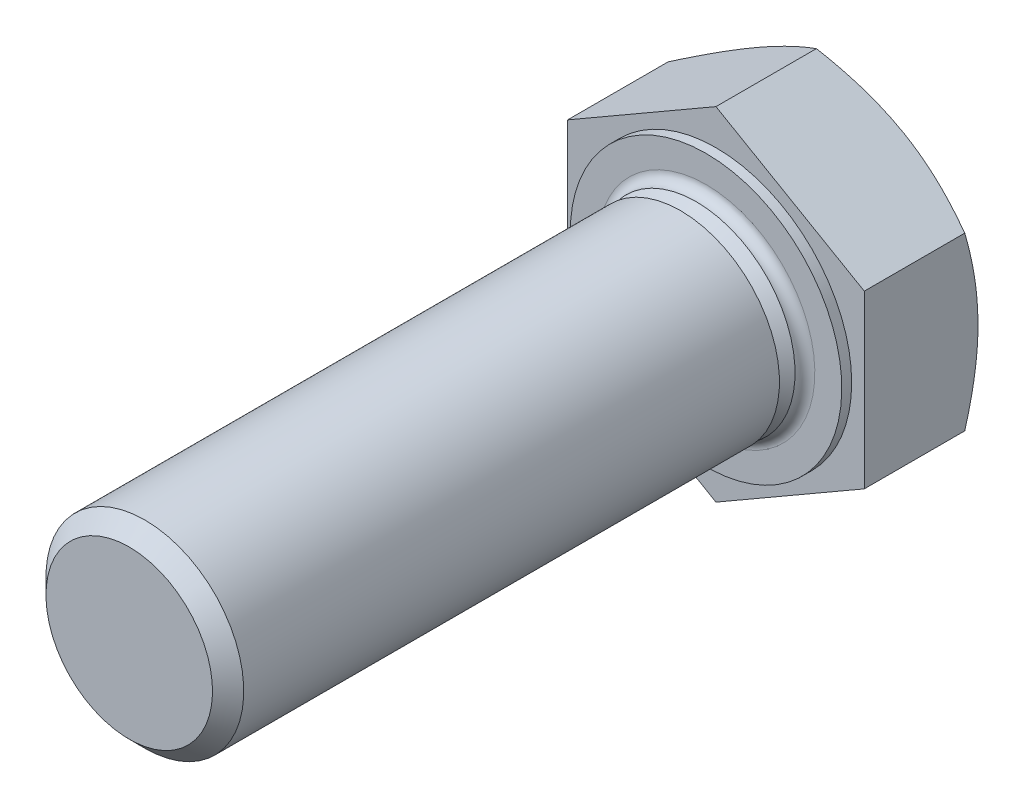
ISO-10303-21;
HEADER;
FILE_DESCRIPTION(('STEP AP214'),'2;1');
FILE_NAME('part.step','',(''),(''),'','','');
FILE_SCHEMA(('AUTOMOTIVE_DESIGN { 1 0 10303 214 1 1 1 1 }'));
ENDSEC;
DATA;
#1=APPLICATION_CONTEXT('core data for automotive mechanical design processes');
#2=APPLICATION_PROTOCOL_DEFINITION('international standard','automotive_design',2000,#1);
#3=PRODUCT_CONTEXT('',#1,'mechanical');
#4=PRODUCT('Part','Part','',(#3));
#5=PRODUCT_RELATED_PRODUCT_CATEGORY('part','',(#4));
#6=PRODUCT_DEFINITION_FORMATION('','',#4);
#7=PRODUCT_DEFINITION_CONTEXT('part definition',#1,'design');
#8=PRODUCT_DEFINITION('design','',#6,#7);
#9=PRODUCT_DEFINITION_SHAPE('','',#8);
#10=(LENGTH_UNIT() NAMED_UNIT(*) SI_UNIT(.MILLI.,.METRE.));
#11=(NAMED_UNIT(*) PLANE_ANGLE_UNIT() SI_UNIT($,.RADIAN.));
#12=(NAMED_UNIT(*) SI_UNIT($,.STERADIAN.) SOLID_ANGLE_UNIT());
#13=UNCERTAINTY_MEASURE_WITH_UNIT(LENGTH_MEASURE(1.E-05),#10,'distance_accuracy_value','');
#14=(GEOMETRIC_REPRESENTATION_CONTEXT(3) GLOBAL_UNCERTAINTY_ASSIGNED_CONTEXT((#13)) GLOBAL_UNIT_ASSIGNED_CONTEXT((#10,
#11,#12)) REPRESENTATION_CONTEXT('',''));
#15=CARTESIAN_POINT('',(0.,0.,0.));
#16=DIRECTION('',(0.,0.,1.));
#17=DIRECTION('',(1.,0.,0.));
#18=AXIS2_PLACEMENT_3D('',#15,#16,#17);
#19=CARTESIAN_POINT('',(0.,2.52640625,35.));
#20=DIRECTION('',(0.,0.,1.));
#21=DIRECTION('',(0.,1.,0.));
#22=AXIS2_PLACEMENT_3D('',#19,#20,#21);
#23=PLANE('',#22);
#24=CARTESIAN_POINT('',(0.,0.,35.));
#25=DIRECTION('',(0.,0.,1.));
#26=DIRECTION('',(0.,1.,0.));
#27=AXIS2_PLACEMENT_3D('',#24,#25,#26);
#28=CIRCLE('',#27,5.0528125);
#29=CARTESIAN_POINT('',(0.,5.0528125,35.));
#30=VERTEX_POINT('',#29);
#31=EDGE_CURVE('E11',#30,#30,#28,.T.);
#32=ORIENTED_EDGE('',*,*,#31,.T.);
#33=EDGE_LOOP('',(#32));
#34=FACE_BOUND('',#33,.T.);
#35=ADVANCED_FACE('F17',(#34),#23,.T.);
#36=CARTESIAN_POINT('',(0.,0.,34.52640625));
#37=DIRECTION('',(0.,0.,-1.));
#38=DIRECTION('',(0.,1.,0.));
#39=AXIS2_PLACEMENT_3D('',#36,#37,#38);
#40=CONICAL_SURFACE('',#39,5.52640625,0.785398163397449);
#41=CARTESIAN_POINT('',(0.,0.,34.0528125));
#42=DIRECTION('',(0.,0.,1.));
#43=DIRECTION('',(0.,1.,0.));
#44=AXIS2_PLACEMENT_3D('',#41,#42,#43);
#45=CIRCLE('',#44,6.);
#46=CARTESIAN_POINT('',(0.,6.,34.0528125));
#47=VERTEX_POINT('',#46);
#48=EDGE_CURVE('E27',#47,#47,#45,.T.);
#49=ORIENTED_EDGE('',*,*,#48,.T.);
#50=EDGE_LOOP('',(#49));
#51=FACE_BOUND('',#50,.T.);
#52=ORIENTED_EDGE('',*,*,#31,.F.);
#53=EDGE_LOOP('',(#52));
#54=FACE_BOUND('',#53,.T.);
#55=ADVANCED_FACE('F321',(#51,#54),#40,.T.);
#56=CARTESIAN_POINT('',(0.,0.,17.8));
#57=DIRECTION('',(0.,0.,-1.));
#58=DIRECTION('',(0.,1.,0.));
#59=AXIS2_PLACEMENT_3D('',#56,#57,#58);
#60=CYLINDRICAL_SURFACE('',#59,6.);
#61=CARTESIAN_POINT('',(0.,0.,1.5471875));
#62=DIRECTION('',(0.,0.,1.));
#63=DIRECTION('',(0.,1.,0.));
#64=AXIS2_PLACEMENT_3D('',#61,#62,#63);
#65=CIRCLE('',#64,6.);
#66=CARTESIAN_POINT('',(0.,6.,1.5471875));
#67=VERTEX_POINT('',#66);
#68=EDGE_CURVE('E257',#67,#67,#65,.T.);
#69=ORIENTED_EDGE('',*,*,#68,.T.);
#70=EDGE_LOOP('',(#69));
#71=FACE_BOUND('',#70,.T.);
#72=ORIENTED_EDGE('',*,*,#48,.F.);
#73=EDGE_LOOP('',(#72));
#74=FACE_BOUND('',#73,.T.);
#75=ADVANCED_FACE('F326',(#71,#74),#60,.T.);
#76=CARTESIAN_POINT('',(0.,5.52640625,1.5471875));
#77=DIRECTION('',(0.,0.,-1.));
#78=DIRECTION('',(0.,-1.,0.));
#79=AXIS2_PLACEMENT_3D('',#76,#77,#78);
#80=PLANE('',#79);
#81=CARTESIAN_POINT('',(0.,0.,1.5471875));
#82=DIRECTION('',(0.,0.,1.));
#83=DIRECTION('',(0.,1.,0.));
#84=AXIS2_PLACEMENT_3D('',#81,#82,#83);
#85=CIRCLE('',#84,5.0528125);
#86=CARTESIAN_POINT('',(0.,5.0528125,1.5471875));
#87=VERTEX_POINT('',#86);
#88=EDGE_CURVE('E278',#87,#87,#85,.T.);
#89=ORIENTED_EDGE('',*,*,#88,.T.);
#90=EDGE_LOOP('',(#89));
#91=FACE_BOUND('',#90,.T.);
#92=ORIENTED_EDGE('',*,*,#68,.F.);
#93=EDGE_LOOP('',(#92));
#94=FACE_BOUND('',#93,.T.);
#95=ADVANCED_FACE('F350',(#91,#94),#80,.T.);
#96=CARTESIAN_POINT('',(0.,0.,1.07359375));
#97=DIRECTION('',(0.,0.,-1.));
#98=DIRECTION('',(0.,1.,0.));
#99=AXIS2_PLACEMENT_3D('',#96,#97,#98);
#100=CONICAL_SURFACE('',#99,5.52640625,0.785398163397448);
#101=CARTESIAN_POINT('',(0.,0.,0.6));
#102=DIRECTION('',(0.,0.,1.));
#103=DIRECTION('',(0.,1.,0.));
#104=AXIS2_PLACEMENT_3D('',#101,#102,#103);
#105=CIRCLE('',#104,6.);
#106=CARTESIAN_POINT('',(0.,6.,0.6));
#107=VERTEX_POINT('',#106);
#108=EDGE_CURVE('E21',#107,#107,#105,.T.);
#109=ORIENTED_EDGE('',*,*,#108,.T.);
#110=EDGE_LOOP('',(#109));
#111=FACE_BOUND('',#110,.T.);
#112=ORIENTED_EDGE('',*,*,#88,.F.);
#113=EDGE_LOOP('',(#112));
#114=FACE_BOUND('',#113,.T.);
#115=ADVANCED_FACE('F353',(#111,#114),#100,.T.);
#116=CARTESIAN_POINT('',(0.,0.,0.6));
#117=DIRECTION('',(0.,0.,1.));
#118=DIRECTION('',(1.,0.,0.));
#119=AXIS2_PLACEMENT_3D('',#116,#117,#118);
#120=TOROIDAL_SURFACE('',#119,6.6,0.6);
#121=CARTESIAN_POINT('',(0.,0.,0.));
#122=DIRECTION('',(0.,0.,1.));
#123=DIRECTION('',(0.,1.,0.));
#124=AXIS2_PLACEMENT_3D('',#121,#122,#123);
#125=CIRCLE('',#124,6.6);
#126=CARTESIAN_POINT('',(0.,6.6,0.));
#127=VERTEX_POINT('',#126);
#128=EDGE_CURVE('E185',#127,#127,#125,.T.);
#129=ORIENTED_EDGE('',*,*,#128,.T.);
#130=EDGE_LOOP('',(#129));
#131=FACE_BOUND('',#130,.T.);
#132=ORIENTED_EDGE('',*,*,#108,.F.);
#133=EDGE_LOOP('',(#132));
#134=FACE_BOUND('',#133,.T.);
#135=ADVANCED_FACE('F346',(#131,#134),#120,.F.);
#136=CARTESIAN_POINT('',(0.,7.4175,0.));
#137=DIRECTION('',(0.,0.,1.));
#138=DIRECTION('',(0.,1.,0.));
#139=AXIS2_PLACEMENT_3D('',#136,#137,#138);
#140=PLANE('',#139);
#141=CARTESIAN_POINT('',(0.,0.,0.));
#142=DIRECTION('',(0.,0.,1.));
#143=DIRECTION('',(0.,1.,0.));
#144=AXIS2_PLACEMENT_3D('',#141,#142,#143);
#145=CIRCLE('',#144,8.235);
#146=CARTESIAN_POINT('',(0.,8.235,0.));
#147=VERTEX_POINT('',#146);
#148=EDGE_CURVE('E190',#147,#147,#145,.T.);
#149=ORIENTED_EDGE('',*,*,#148,.T.);
#150=EDGE_LOOP('',(#149));
#151=FACE_BOUND('',#150,.T.);
#152=ORIENTED_EDGE('',*,*,#128,.F.);
#153=EDGE_LOOP('',(#152));
#154=FACE_BOUND('',#153,.T.);
#155=ADVANCED_FACE('F347',(#151,#154),#140,.T.);
#156=CARTESIAN_POINT('',(0.,0.,-0.55));
#157=DIRECTION('',(0.,0.,-1.));
#158=DIRECTION('',(0.,1.,0.));
#159=AXIS2_PLACEMENT_3D('',#156,#157,#158);
#160=CYLINDRICAL_SURFACE('',#159,8.235);
#161=ORIENTED_EDGE('',*,*,#148,.F.);
#162=EDGE_LOOP('',(#161));
#163=FACE_BOUND('',#162,.T.);
#164=CARTESIAN_POINT('',(0.,0.,-0.6));
#165=DIRECTION('',(0.,0.,1.));
#166=DIRECTION('',(0.,1.,0.));
#167=AXIS2_PLACEMENT_3D('',#164,#165,#166);
#168=CIRCLE('',#167,8.235);
#169=CARTESIAN_POINT('',(0.,-8.235,-0.6));
#170=VERTEX_POINT('',#169);
#171=EDGE_CURVE('E156',#170,#170,#168,.T.);
#172=ORIENTED_EDGE('',*,*,#171,.T.);
#173=EDGE_LOOP('',(#172));
#174=FACE_BOUND('',#173,.T.);
#175=ADVANCED_FACE('F330',(#163,#174),#160,.T.);
#176=CARTESIAN_POINT('',(-4.5,-7.79422863405995,0.4));
#177=DIRECTION('',(-0.5,-0.866025403784439,0.));
#178=DIRECTION('',(-0.866025403784439,0.5,0.));
#179=AXIS2_PLACEMENT_3D('',#176,#177,#178);
#180=PLANE('',#179);
#181=CARTESIAN_POINT('',(0.00466633059542045,-10.3949989526387,-6.69459637448047));
#182=CARTESIAN_POINT('',(-2.4096675960114,-9.00108261019856,-7.49999999999999));
#183=CARTESIAN_POINT('',(-4.5,-7.79422863405995,-7.5));
#184=CARTESIAN_POINT('',(-6.59033240398861,-6.58737465792134,-7.50000000000001));
#185=CARTESIAN_POINT('',(-9.00466633059542,-5.19345831548124,-6.69459637448047));
#186=(BOUNDED_CURVE() B_SPLINE_CURVE(2,(#181,#182,#183,#184,#185),.UNSPECIFIED.,.F.,
.F.) B_SPLINE_CURVE_WITH_KNOTS((3,2,3),(0.,5.27698475776278,10.5539695155256),
.UNSPECIFIED.) CURVE() GEOMETRIC_REPRESENTATION_ITEM() RATIONAL_B_SPLINE_CURVE((1.,
1.03802697460135,1.,1.03802697460134,1.)) REPRESENTATION_ITEM(''));
#187=CARTESIAN_POINT('',(0.,-10.3923048454133,-6.69615242270663));
#188=VERTEX_POINT('',#187);
#189=CARTESIAN_POINT('',(-4.5,-7.79422863405995,-7.5));
#190=VERTEX_POINT('',#189);
#191=EDGE_CURVE('E233',#188,#190,#186,.T.);
#192=ORIENTED_EDGE('',*,*,#191,.F.);
#193=DIRECTION('',(0.,0.,-1.));
#194=VECTOR('',#193,1.);
#195=CARTESIAN_POINT('',(0.,-10.3923048454133,0.4));
#196=LINE('',#195,#194);
#197=CARTESIAN_POINT('',(0.,-10.3923048454133,-0.6));
#198=VERTEX_POINT('',#197);
#199=EDGE_CURVE('E151',#198,#188,#196,.T.);
#200=ORIENTED_EDGE('',*,*,#199,.F.);
#201=DIRECTION('',(0.866025403784439,-0.5,0.));
#202=VECTOR('',#201,1.);
#203=CARTESIAN_POINT('',(-3.3747082409576,-8.44391613405995,-0.6));
#204=LINE('',#203,#202);
#205=CARTESIAN_POINT('',(-9.,-5.19615242270663,-0.6));
#206=VERTEX_POINT('',#205);
#207=EDGE_CURVE('E192',#206,#198,#204,.T.);
#208=ORIENTED_EDGE('',*,*,#207,.F.);
#209=DIRECTION('',(0.,0.,-1.));
#210=VECTOR('',#209,1.);
#211=CARTESIAN_POINT('',(-9.,-5.19615242270663,0.4));
#212=LINE('',#211,#210);
#213=CARTESIAN_POINT('',(-9.,-5.19615242270663,-6.69615242270663));
#214=VERTEX_POINT('',#213);
#215=EDGE_CURVE('E148',#206,#214,#212,.T.);
#216=ORIENTED_EDGE('',*,*,#215,.T.);
#217=CARTESIAN_POINT('',(0.00466633059542045,-10.3949989526387,-6.69459637448047));
#218=CARTESIAN_POINT('',(-2.4096675960114,-9.00108261019856,-7.49999999999999));
#219=CARTESIAN_POINT('',(-4.5,-7.79422863405995,-7.5));
#220=CARTESIAN_POINT('',(-6.59033240398861,-6.58737465792134,-7.50000000000001));
#221=CARTESIAN_POINT('',(-9.00466633059542,-5.19345831548124,-6.69459637448047));
#222=(BOUNDED_CURVE() B_SPLINE_CURVE(2,(#217,#218,#219,#220,#221),.UNSPECIFIED.,.F.,
.F.) B_SPLINE_CURVE_WITH_KNOTS((3,2,3),(0.,5.27698475776278,10.5539695155256),
.UNSPECIFIED.) CURVE() GEOMETRIC_REPRESENTATION_ITEM() RATIONAL_B_SPLINE_CURVE((1.,
1.03802697460135,1.,1.03802697460134,1.)) REPRESENTATION_ITEM(''));
#223=EDGE_CURVE('E232',#190,#214,#222,.T.);
#224=ORIENTED_EDGE('',*,*,#223,.F.);
#225=EDGE_LOOP('',(#192,#200,#208,#216,#224));
#226=FACE_BOUND('',#225,.T.);
#227=ADVANCED_FACE('F297',(#226),#180,.T.);
#228=CARTESIAN_POINT('',(9.,0.,0.4));
#229=DIRECTION('',(1.,0.,0.));
#230=DIRECTION('',(0.,-1.,0.));
#231=AXIS2_PLACEMENT_3D('',#228,#229,#230);
#232=PLANE('',#231);
#233=CARTESIAN_POINT('',(9.,5.20154063715742,-6.69459637448047));
#234=CARTESIAN_POINT('',(8.99999999999999,2.41370795227724,-7.5));
#235=CARTESIAN_POINT('',(9.,0.,-7.5));
#236=CARTESIAN_POINT('',(9.00000000000001,-2.41370795227723,-7.5));
#237=CARTESIAN_POINT('',(9.,-5.20154063715742,-6.69459637448047));
#238=(BOUNDED_CURVE() B_SPLINE_CURVE(2,(#233,#234,#235,#236,#237),.UNSPECIFIED.,.F.,
.F.) B_SPLINE_CURVE_WITH_KNOTS((3,2,3),(0.,5.27698475776278,10.5539695155256),
.UNSPECIFIED.) CURVE() GEOMETRIC_REPRESENTATION_ITEM() RATIONAL_B_SPLINE_CURVE((1.,
1.03802697460134,1.,1.03802697460134,1.)) REPRESENTATION_ITEM(''));
#239=CARTESIAN_POINT('',(9.,5.19615242270664,-6.69615242270663));
#240=VERTEX_POINT('',#239);
#241=CARTESIAN_POINT('',(9.,0.,-7.5));
#242=VERTEX_POINT('',#241);
#243=EDGE_CURVE('E127',#240,#242,#238,.T.);
#244=ORIENTED_EDGE('',*,*,#243,.F.);
#245=DIRECTION('',(0.,0.,-1.));
#246=VECTOR('',#245,1.);
#247=CARTESIAN_POINT('',(9.,5.19615242270664,0.4));
#248=LINE('',#247,#246);
#249=CARTESIAN_POINT('',(9.,5.19615242270664,-0.6));
#250=VERTEX_POINT('',#249);
#251=EDGE_CURVE('E117',#250,#240,#248,.T.);
#252=ORIENTED_EDGE('',*,*,#251,.F.);
#253=DIRECTION('',(0.,1.,0.));
#254=VECTOR('',#253,1.);
#255=CARTESIAN_POINT('',(9.,-2.59875,-0.6));
#256=LINE('',#255,#254);
#257=CARTESIAN_POINT('',(9.,-5.19615242270663,-0.6));
#258=VERTEX_POINT('',#257);
#259=EDGE_CURVE('E184',#258,#250,#256,.T.);
#260=ORIENTED_EDGE('',*,*,#259,.F.);
#261=DIRECTION('',(0.,0.,-1.));
#262=VECTOR('',#261,1.);
#263=CARTESIAN_POINT('',(9.,-5.19615242270663,0.4));
#264=LINE('',#263,#262);
#265=CARTESIAN_POINT('',(9.,-5.19615242270663,-6.69615242270663));
#266=VERTEX_POINT('',#265);
#267=EDGE_CURVE('E149',#258,#266,#264,.T.);
#268=ORIENTED_EDGE('',*,*,#267,.T.);
#269=CARTESIAN_POINT('',(9.,5.20154063715742,-6.69459637448047));
#270=CARTESIAN_POINT('',(8.99999999999999,2.41370795227724,-7.5));
#271=CARTESIAN_POINT('',(9.,0.,-7.5));
#272=CARTESIAN_POINT('',(9.00000000000001,-2.41370795227723,-7.5));
#273=CARTESIAN_POINT('',(9.,-5.20154063715742,-6.69459637448047));
#274=(BOUNDED_CURVE() B_SPLINE_CURVE(2,(#269,#270,#271,#272,#273),.UNSPECIFIED.,.F.,
.F.) B_SPLINE_CURVE_WITH_KNOTS((3,2,3),(0.,5.27698475776278,10.5539695155256),
.UNSPECIFIED.) CURVE() GEOMETRIC_REPRESENTATION_ITEM() RATIONAL_B_SPLINE_CURVE((1.,
1.03802697460134,1.,1.03802697460134,1.)) REPRESENTATION_ITEM(''));
#275=EDGE_CURVE('E157',#242,#266,#274,.T.);
#276=ORIENTED_EDGE('',*,*,#275,.F.);
#277=EDGE_LOOP('',(#244,#252,#260,#268,#276));
#278=FACE_BOUND('',#277,.T.);
#279=ADVANCED_FACE('F307',(#278),#232,.T.);
#280=CARTESIAN_POINT('',(4.5,-7.79422863405995,0.4));
#281=DIRECTION('',(0.5,-0.866025403784439,0.));
#282=DIRECTION('',(-0.866025403784439,-0.5,0.));
#283=AXIS2_PLACEMENT_3D('',#280,#281,#282);
#284=PLANE('',#283);
#285=CARTESIAN_POINT('',(9.00466633059542,-5.19345831548124,-6.69459637448047));
#286=CARTESIAN_POINT('',(6.5903324039886,-6.58737465792133,-7.5));
#287=CARTESIAN_POINT('',(4.5,-7.79422863405995,-7.5));
#288=CARTESIAN_POINT('',(2.40966759601141,-9.00108261019856,-7.5));
#289=CARTESIAN_POINT('',(-0.00466633059541883,-10.3949989526387,-6.69459637448047));
#290=(BOUNDED_CURVE() B_SPLINE_CURVE(2,(#285,#286,#287,#288,#289),.UNSPECIFIED.,.F.,
.F.) B_SPLINE_CURVE_WITH_KNOTS((3,2,3),(0.,5.27698475776278,10.5539695155256),
.UNSPECIFIED.) CURVE() GEOMETRIC_REPRESENTATION_ITEM() RATIONAL_B_SPLINE_CURVE((1.,
1.03802697460133,1.,1.03802697460134,1.)) REPRESENTATION_ITEM(''));
#291=CARTESIAN_POINT('',(4.5,-7.79422863405995,-7.5));
#292=VERTEX_POINT('',#291);
#293=EDGE_CURVE('E164',#266,#292,#290,.T.);
#294=ORIENTED_EDGE('',*,*,#293,.F.);
#295=ORIENTED_EDGE('',*,*,#267,.F.);
#296=DIRECTION('',(0.866025403784439,0.5,0.));
#297=VECTOR('',#296,1.);
#298=CARTESIAN_POINT('',(3.3747082409576,-8.44391613405995,-0.6));
#299=LINE('',#298,#297);
#300=EDGE_CURVE('E203',#198,#258,#299,.T.);
#301=ORIENTED_EDGE('',*,*,#300,.F.);
#302=ORIENTED_EDGE('',*,*,#199,.T.);
#303=CARTESIAN_POINT('',(9.00466633059542,-5.19345831548124,-6.69459637448047));
#304=CARTESIAN_POINT('',(6.5903324039886,-6.58737465792133,-7.5));
#305=CARTESIAN_POINT('',(4.5,-7.79422863405995,-7.5));
#306=CARTESIAN_POINT('',(2.40966759601141,-9.00108261019856,-7.5));
#307=CARTESIAN_POINT('',(-0.00466633059541883,-10.3949989526387,-6.69459637448047));
#308=(BOUNDED_CURVE() B_SPLINE_CURVE(2,(#303,#304,#305,#306,#307),.UNSPECIFIED.,.F.,
.F.) B_SPLINE_CURVE_WITH_KNOTS((3,2,3),(0.,5.27698475776278,10.5539695155256),
.UNSPECIFIED.) CURVE() GEOMETRIC_REPRESENTATION_ITEM() RATIONAL_B_SPLINE_CURVE((1.,
1.03802697460133,1.,1.03802697460134,1.)) REPRESENTATION_ITEM(''));
#309=EDGE_CURVE('E242',#292,#188,#308,.T.);
#310=ORIENTED_EDGE('',*,*,#309,.F.);
#311=EDGE_LOOP('',(#294,#295,#301,#302,#310));
#312=FACE_BOUND('',#311,.T.);
#313=ADVANCED_FACE('F208',(#312),#284,.T.);
#314=CARTESIAN_POINT('',(-9.,0.,0.4));
#315=DIRECTION('',(-1.,0.,0.));
#316=DIRECTION('',(0.,1.,0.));
#317=AXIS2_PLACEMENT_3D('',#314,#315,#316);
#318=PLANE('',#317);
#319=CARTESIAN_POINT('',(-9.,-5.20154063715742,-6.69459637448047));
#320=CARTESIAN_POINT('',(-9.,-2.41370795227722,-7.5));
#321=CARTESIAN_POINT('',(-9.,0.,-7.5));
#322=CARTESIAN_POINT('',(-9.,2.41370795227723,-7.5));
#323=CARTESIAN_POINT('',(-9.,5.20154063715742,-6.69459637448047));
#324=(BOUNDED_CURVE() B_SPLINE_CURVE(2,(#319,#320,#321,#322,#323),.UNSPECIFIED.,.F.,
.F.) B_SPLINE_CURVE_WITH_KNOTS((3,2,3),(0.,5.27698475776278,10.5539695155256),
.UNSPECIFIED.) CURVE() GEOMETRIC_REPRESENTATION_ITEM() RATIONAL_B_SPLINE_CURVE((1.,
1.03802697460134,1.,1.03802697460134,1.)) REPRESENTATION_ITEM(''));
#325=CARTESIAN_POINT('',(-9.,0.,-7.5));
#326=VERTEX_POINT('',#325);
#327=CARTESIAN_POINT('',(-9.,5.19615242270663,-6.69615242270663));
#328=VERTEX_POINT('',#327);
#329=EDGE_CURVE('E133',#326,#328,#324,.T.);
#330=ORIENTED_EDGE('',*,*,#329,.F.);
#331=CARTESIAN_POINT('',(-9.,-5.20154063715742,-6.69459637448047));
#332=CARTESIAN_POINT('',(-9.,-2.41370795227722,-7.5));
#333=CARTESIAN_POINT('',(-9.,0.,-7.5));
#334=CARTESIAN_POINT('',(-9.,2.41370795227723,-7.5));
#335=CARTESIAN_POINT('',(-9.,5.20154063715742,-6.69459637448047));
#336=(BOUNDED_CURVE() B_SPLINE_CURVE(2,(#331,#332,#333,#334,#335),.UNSPECIFIED.,.F.,
.F.) B_SPLINE_CURVE_WITH_KNOTS((3,2,3),(0.,5.27698475776278,10.5539695155256),
.UNSPECIFIED.) CURVE() GEOMETRIC_REPRESENTATION_ITEM() RATIONAL_B_SPLINE_CURVE((1.,
1.03802697460134,1.,1.03802697460134,1.)) REPRESENTATION_ITEM(''));
#337=EDGE_CURVE('E223',#214,#326,#336,.T.);
#338=ORIENTED_EDGE('',*,*,#337,.F.);
#339=ORIENTED_EDGE('',*,*,#215,.F.);
#340=DIRECTION('',(0.,-1.,0.));
#341=VECTOR('',#340,1.);
#342=CARTESIAN_POINT('',(-9.,-2.59875,-0.6));
#343=LINE('',#342,#341);
#344=CARTESIAN_POINT('',(-9.,5.19615242270663,-0.6));
#345=VERTEX_POINT('',#344);
#346=EDGE_CURVE('E194',#345,#206,#343,.T.);
#347=ORIENTED_EDGE('',*,*,#346,.F.);
#348=DIRECTION('',(0.,0.,-1.));
#349=VECTOR('',#348,1.);
#350=CARTESIAN_POINT('',(-9.,5.19615242270663,0.4));
#351=LINE('',#350,#349);
#352=EDGE_CURVE('E118',#345,#328,#351,.T.);
#353=ORIENTED_EDGE('',*,*,#352,.T.);
#354=EDGE_LOOP('',(#330,#338,#339,#347,#353));
#355=FACE_BOUND('',#354,.T.);
#356=ADVANCED_FACE('F305',(#355),#318,.T.);
#357=CARTESIAN_POINT('',(4.5,7.79422863405995,0.4));
#358=DIRECTION('',(0.5,0.866025403784439,0.));
#359=DIRECTION('',(0.866025403784439,-0.5,0.));
#360=AXIS2_PLACEMENT_3D('',#357,#358,#359);
#361=PLANE('',#360);
#362=CARTESIAN_POINT('',(-0.00466633059542454,10.3949989526387,-6.69459637448047));
#363=CARTESIAN_POINT('',(2.40966759601141,9.00108261019857,-7.50000000000001));
#364=CARTESIAN_POINT('',(4.5,7.79422863405995,-7.5));
#365=CARTESIAN_POINT('',(6.59033240398859,6.58737465792134,-7.5));
#366=CARTESIAN_POINT('',(9.00466633059542,5.19345831548124,-6.69459637448047));
#367=(BOUNDED_CURVE() B_SPLINE_CURVE(2,(#362,#363,#364,#365,#366),.UNSPECIFIED.,.F.,
.F.) B_SPLINE_CURVE_WITH_KNOTS((3,2,3),(0.,5.27698475776278,10.5539695155256),
.UNSPECIFIED.) CURVE() GEOMETRIC_REPRESENTATION_ITEM() RATIONAL_B_SPLINE_CURVE((1.,
1.03802697460134,1.,1.03802697460133,1.)) REPRESENTATION_ITEM(''));
#368=CARTESIAN_POINT('',(4.5,7.79422863405995,-7.5));
#369=VERTEX_POINT('',#368);
#370=EDGE_CURVE('E131',#369,#240,#367,.T.);
#371=ORIENTED_EDGE('',*,*,#370,.F.);
#372=CARTESIAN_POINT('',(-0.00466633059542454,10.3949989526387,-6.69459637448047));
#373=CARTESIAN_POINT('',(2.40966759601141,9.00108261019857,-7.50000000000001));
#374=CARTESIAN_POINT('',(4.5,7.79422863405995,-7.5));
#375=CARTESIAN_POINT('',(6.59033240398859,6.58737465792134,-7.5));
#376=CARTESIAN_POINT('',(9.00466633059542,5.19345831548124,-6.69459637448047));
#377=(BOUNDED_CURVE() B_SPLINE_CURVE(2,(#372,#373,#374,#375,#376),.UNSPECIFIED.,.F.,
.F.) B_SPLINE_CURVE_WITH_KNOTS((3,2,3),(0.,5.27698475776278,10.5539695155256),
.UNSPECIFIED.) CURVE() GEOMETRIC_REPRESENTATION_ITEM() RATIONAL_B_SPLINE_CURVE((1.,
1.03802697460134,1.,1.03802697460133,1.)) REPRESENTATION_ITEM(''));
#378=CARTESIAN_POINT('',(0.,10.3923048454133,-6.69615242270663));
#379=VERTEX_POINT('',#378);
#380=EDGE_CURVE('E123',#379,#369,#377,.T.);
#381=ORIENTED_EDGE('',*,*,#380,.F.);
#382=DIRECTION('',(0.,0.,-1.));
#383=VECTOR('',#382,1.);
#384=CARTESIAN_POINT('',(0.,10.3923048454133,0.4));
#385=LINE('',#384,#383);
#386=CARTESIAN_POINT('',(0.,10.3923048454133,-0.6));
#387=VERTEX_POINT('',#386);
#388=EDGE_CURVE('E105',#387,#379,#385,.T.);
#389=ORIENTED_EDGE('',*,*,#388,.F.);
#390=DIRECTION('',(-0.866025403784439,0.5,0.));
#391=VECTOR('',#390,1.);
#392=CARTESIAN_POINT('',(5.6252917590424,7.14454113405995,-0.6));
#393=LINE('',#392,#391);
#394=EDGE_CURVE('E213',#250,#387,#393,.T.);
#395=ORIENTED_EDGE('',*,*,#394,.F.);
#396=ORIENTED_EDGE('',*,*,#251,.T.);
#397=EDGE_LOOP('',(#371,#381,#389,#395,#396));
#398=FACE_BOUND('',#397,.T.);
#399=ADVANCED_FACE('F129',(#398),#361,.T.);
#400=CARTESIAN_POINT('',(-4.5,7.79422863405995,0.4));
#401=DIRECTION('',(-0.5,0.866025403784439,0.));
#402=DIRECTION('',(0.866025403784439,0.5,0.));
#403=AXIS2_PLACEMENT_3D('',#400,#401,#402);
#404=PLANE('',#403);
#405=CARTESIAN_POINT('',(-9.00466633059543,5.19345831548123,-6.69459637448047));
#406=CARTESIAN_POINT('',(-6.5903324039886,6.58737465792133,-7.5));
#407=CARTESIAN_POINT('',(-4.5,7.79422863405994,-7.5));
#408=CARTESIAN_POINT('',(-2.40966759601141,9.00108261019856,-7.50000000000001));
#409=CARTESIAN_POINT('',(0.00466633059542045,10.3949989526387,-6.69459637448047));
#410=(BOUNDED_CURVE() B_SPLINE_CURVE(2,(#405,#406,#407,#408,#409),.UNSPECIFIED.,.F.,
.F.) B_SPLINE_CURVE_WITH_KNOTS((3,2,3),(0.,5.27698475776279,10.5539695155256),
.UNSPECIFIED.) CURVE() GEOMETRIC_REPRESENTATION_ITEM() RATIONAL_B_SPLINE_CURVE((1.,
1.03802697460135,1.,1.03802697460134,1.)) REPRESENTATION_ITEM(''));
#411=CARTESIAN_POINT('',(-4.5,7.79422863405994,-7.5));
#412=VERTEX_POINT('',#411);
#413=EDGE_CURVE('E109',#412,#379,#410,.T.);
#414=ORIENTED_EDGE('',*,*,#413,.F.);
#415=CARTESIAN_POINT('',(-9.00466633059543,5.19345831548123,-6.69459637448047));
#416=CARTESIAN_POINT('',(-6.5903324039886,6.58737465792133,-7.5));
#417=CARTESIAN_POINT('',(-4.5,7.79422863405994,-7.5));
#418=CARTESIAN_POINT('',(-2.40966759601141,9.00108261019856,-7.50000000000001));
#419=CARTESIAN_POINT('',(0.00466633059542045,10.3949989526387,-6.69459637448047));
#420=(BOUNDED_CURVE() B_SPLINE_CURVE(2,(#415,#416,#417,#418,#419),.UNSPECIFIED.,.F.,
.F.) B_SPLINE_CURVE_WITH_KNOTS((3,2,3),(0.,5.27698475776279,10.5539695155256),
.UNSPECIFIED.) CURVE() GEOMETRIC_REPRESENTATION_ITEM() RATIONAL_B_SPLINE_CURVE((1.,
1.03802697460135,1.,1.03802697460134,1.)) REPRESENTATION_ITEM(''));
#421=EDGE_CURVE('E152',#328,#412,#420,.T.);
#422=ORIENTED_EDGE('',*,*,#421,.F.);
#423=ORIENTED_EDGE('',*,*,#352,.F.);
#424=DIRECTION('',(-0.866025403784439,-0.5,0.));
#425=VECTOR('',#424,1.);
#426=CARTESIAN_POINT('',(-5.62529175904241,7.14454113405994,-0.6));
#427=LINE('',#426,#425);
#428=EDGE_CURVE('E112',#387,#345,#427,.T.);
#429=ORIENTED_EDGE('',*,*,#428,.F.);
#430=ORIENTED_EDGE('',*,*,#388,.T.);
#431=EDGE_LOOP('',(#414,#422,#423,#429,#430));
#432=FACE_BOUND('',#431,.T.);
#433=ADVANCED_FACE('F107',(#432),#404,.T.);
#434=CARTESIAN_POINT('',(0.,-4.5,-7.5));
#435=DIRECTION('',(0.,0.,-1.));
#436=DIRECTION('',(0.,-1.,0.));
#437=AXIS2_PLACEMENT_3D('',#434,#435,#436);
#438=PLANE('',#437);
#439=CARTESIAN_POINT('',(0.,0.,-7.5));
#440=DIRECTION('',(0.,0.,-1.));
#441=DIRECTION('',(0.,-1.,0.));
#442=AXIS2_PLACEMENT_3D('',#439,#440,#441);
#443=CIRCLE('',#442,9.);
#444=EDGE_CURVE('E241',#292,#190,#443,.T.);
#445=ORIENTED_EDGE('',*,*,#444,.T.);
#446=CARTESIAN_POINT('',(0.,0.,-7.5));
#447=DIRECTION('',(0.,0.,-1.));
#448=DIRECTION('',(0.,-1.,0.));
#449=AXIS2_PLACEMENT_3D('',#446,#447,#448);
#450=CIRCLE('',#449,9.);
#451=EDGE_CURVE('E231',#190,#326,#450,.T.);
#452=ORIENTED_EDGE('',*,*,#451,.T.);
#453=CARTESIAN_POINT('',(0.,0.,-7.5));
#454=DIRECTION('',(0.,0.,-1.));
#455=DIRECTION('',(0.,-1.,0.));
#456=AXIS2_PLACEMENT_3D('',#453,#454,#455);
#457=CIRCLE('',#456,9.);
#458=EDGE_CURVE('E137',#326,#412,#457,.T.);
#459=ORIENTED_EDGE('',*,*,#458,.T.);
#460=CARTESIAN_POINT('',(0.,0.,-7.5));
#461=DIRECTION('',(0.,0.,-1.));
#462=DIRECTION('',(0.,-1.,0.));
#463=AXIS2_PLACEMENT_3D('',#460,#461,#462);
#464=CIRCLE('',#463,9.);
#465=EDGE_CURVE('E125',#412,#369,#464,.T.);
#466=ORIENTED_EDGE('',*,*,#465,.T.);
#467=CARTESIAN_POINT('',(0.,0.,-7.5));
#468=DIRECTION('',(0.,0.,-1.));
#469=DIRECTION('',(0.,-1.,0.));
#470=AXIS2_PLACEMENT_3D('',#467,#468,#469);
#471=CIRCLE('',#470,9.);
#472=EDGE_CURVE('E173',#369,#242,#471,.T.);
#473=ORIENTED_EDGE('',*,*,#472,.T.);
#474=CARTESIAN_POINT('',(0.,0.,-7.5));
#475=DIRECTION('',(0.,0.,-1.));
#476=DIRECTION('',(0.,-1.,0.));
#477=AXIS2_PLACEMENT_3D('',#474,#475,#476);
#478=CIRCLE('',#477,9.);
#479=EDGE_CURVE('E171',#242,#292,#478,.T.);
#480=ORIENTED_EDGE('',*,*,#479,.T.);
#481=EDGE_LOOP('',(#445,#452,#459,#466,#473,#480));
#482=FACE_BOUND('',#481,.T.);
#483=ADVANCED_FACE('F292',(#482),#438,.T.);
#484=CARTESIAN_POINT('',(0.,0.,-7.09729818724024));
#485=DIRECTION('',(0.,0.,1.));
#486=DIRECTION('',(0.,-1.,0.));
#487=AXIS2_PLACEMENT_3D('',#484,#485,#486);
#488=CONICAL_SURFACE('',#487,9.6975,1.0471975511966);
#489=ORIENTED_EDGE('',*,*,#223,.T.);
#490=ORIENTED_EDGE('',*,*,#337,.T.);
#491=ORIENTED_EDGE('',*,*,#451,.F.);
#492=EDGE_LOOP('',(#489,#490,#491));
#493=FACE_BOUND('',#492,.T.);
#494=ADVANCED_FACE('F300',(#493),#488,.T.);
#495=CARTESIAN_POINT('',(0.,0.,-7.09729818724024));
#496=DIRECTION('',(0.,0.,1.));
#497=DIRECTION('',(0.,-1.,0.));
#498=AXIS2_PLACEMENT_3D('',#495,#496,#497);
#499=CONICAL_SURFACE('',#498,9.6975,1.0471975511966);
#500=ORIENTED_EDGE('',*,*,#309,.T.);
#501=ORIENTED_EDGE('',*,*,#191,.T.);
#502=ORIENTED_EDGE('',*,*,#444,.F.);
#503=EDGE_LOOP('',(#500,#501,#502));
#504=FACE_BOUND('',#503,.T.);
#505=ADVANCED_FACE('F295',(#504),#499,.T.);
#506=CARTESIAN_POINT('',(0.,0.,-7.09729818724024));
#507=DIRECTION('',(0.,0.,1.));
#508=DIRECTION('',(0.,-1.,0.));
#509=AXIS2_PLACEMENT_3D('',#506,#507,#508);
#510=CONICAL_SURFACE('',#509,9.6975,1.0471975511966);
#511=ORIENTED_EDGE('',*,*,#275,.T.);
#512=ORIENTED_EDGE('',*,*,#293,.T.);
#513=ORIENTED_EDGE('',*,*,#479,.F.);
#514=EDGE_LOOP('',(#511,#512,#513));
#515=FACE_BOUND('',#514,.T.);
#516=ADVANCED_FACE('F293',(#515),#510,.T.);
#517=CARTESIAN_POINT('',(0.,0.,-7.09729818724024));
#518=DIRECTION('',(0.,0.,1.));
#519=DIRECTION('',(0.,-1.,0.));
#520=AXIS2_PLACEMENT_3D('',#517,#518,#519);
#521=CONICAL_SURFACE('',#520,9.6975,1.0471975511966);
#522=ORIENTED_EDGE('',*,*,#243,.T.);
#523=ORIENTED_EDGE('',*,*,#472,.F.);
#524=ORIENTED_EDGE('',*,*,#370,.T.);
#525=EDGE_LOOP('',(#522,#523,#524));
#526=FACE_BOUND('',#525,.T.);
#527=ADVANCED_FACE('F308',(#526),#521,.T.);
#528=CARTESIAN_POINT('',(0.,0.,-7.09729818724024));
#529=DIRECTION('',(0.,0.,1.));
#530=DIRECTION('',(0.,-1.,0.));
#531=AXIS2_PLACEMENT_3D('',#528,#529,#530);
#532=CONICAL_SURFACE('',#531,9.6975,1.0471975511966);
#533=ORIENTED_EDGE('',*,*,#380,.T.);
#534=ORIENTED_EDGE('',*,*,#465,.F.);
#535=ORIENTED_EDGE('',*,*,#413,.T.);
#536=EDGE_LOOP('',(#533,#534,#535));
#537=FACE_BOUND('',#536,.T.);
#538=ADVANCED_FACE('F122',(#537),#532,.T.);
#539=CARTESIAN_POINT('',(0.,0.,-7.09729818724024));
#540=DIRECTION('',(0.,0.,1.));
#541=DIRECTION('',(0.,-1.,0.));
#542=AXIS2_PLACEMENT_3D('',#539,#540,#541);
#543=CONICAL_SURFACE('',#542,9.6975,1.0471975511966);
#544=ORIENTED_EDGE('',*,*,#421,.T.);
#545=ORIENTED_EDGE('',*,*,#458,.F.);
#546=ORIENTED_EDGE('',*,*,#329,.T.);
#547=EDGE_LOOP('',(#544,#545,#546));
#548=FACE_BOUND('',#547,.T.);
#549=ADVANCED_FACE('F19',(#548),#543,.T.);
#550=CARTESIAN_POINT('',(0.,-5.1975,-0.6));
#551=DIRECTION('',(0.,0.,1.));
#552=DIRECTION('',(0.,1.,0.));
#553=AXIS2_PLACEMENT_3D('',#550,#551,#552);
#554=PLANE('',#553);
#555=ORIENTED_EDGE('',*,*,#171,.F.);
#556=EDGE_LOOP('',(#555));
#557=FACE_BOUND('',#556,.T.);
#558=ORIENTED_EDGE('',*,*,#300,.T.);
#559=ORIENTED_EDGE('',*,*,#259,.T.);
#560=ORIENTED_EDGE('',*,*,#394,.T.);
#561=ORIENTED_EDGE('',*,*,#428,.T.);
#562=ORIENTED_EDGE('',*,*,#346,.T.);
#563=ORIENTED_EDGE('',*,*,#207,.T.);
#564=EDGE_LOOP('',(#558,#559,#560,#561,#562,#563));
#565=FACE_BOUND('',#564,.T.);
#566=ADVANCED_FACE('F201',(#557,#565),#554,.T.);
#567=CLOSED_SHELL('',(#35,#55,#75,#95,#115,#135,#155,#175,#227,#279,#313,#356,#399,#433,#483,
#494,#505,#516,#527,#538,#549,#566));
#568=MANIFOLD_SOLID_BREP('B1',#567);
#569=ADVANCED_BREP_SHAPE_REPRESENTATION('',(#18,#568),#14);
#570=SHAPE_DEFINITION_REPRESENTATION(#9,#569);
ENDSEC;
END-ISO-10303-21;
